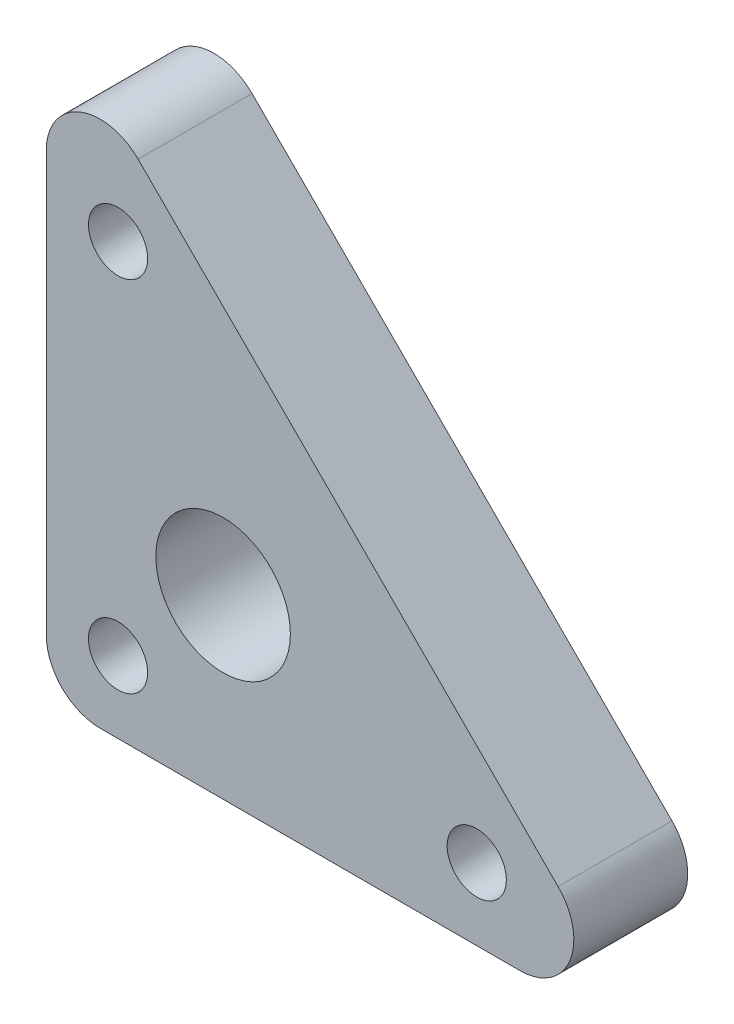
ISO-10303-21;
HEADER;
FILE_DESCRIPTION(('STEP AP214'),'2;1');
FILE_NAME('part.step','',(''),(''),'','','');
FILE_SCHEMA(('AUTOMOTIVE_DESIGN { 1 0 10303 214 1 1 1 1 }'));
ENDSEC;
DATA;
#1=APPLICATION_CONTEXT('core data for automotive mechanical design processes');
#2=APPLICATION_PROTOCOL_DEFINITION('international standard','automotive_design',2000,#1);
#3=PRODUCT_CONTEXT('',#1,'mechanical');
#4=PRODUCT('Part','Part','',(#3));
#5=PRODUCT_RELATED_PRODUCT_CATEGORY('part','',(#4));
#6=PRODUCT_DEFINITION_FORMATION('','',#4);
#7=PRODUCT_DEFINITION_CONTEXT('part definition',#1,'design');
#8=PRODUCT_DEFINITION('design','',#6,#7);
#9=PRODUCT_DEFINITION_SHAPE('','',#8);
#10=(LENGTH_UNIT() NAMED_UNIT(*) SI_UNIT(.MILLI.,.METRE.));
#11=(NAMED_UNIT(*) PLANE_ANGLE_UNIT() SI_UNIT($,.RADIAN.));
#12=(NAMED_UNIT(*) SI_UNIT($,.STERADIAN.) SOLID_ANGLE_UNIT());
#13=UNCERTAINTY_MEASURE_WITH_UNIT(LENGTH_MEASURE(1.E-05),#10,'distance_accuracy_value','');
#14=(GEOMETRIC_REPRESENTATION_CONTEXT(3) GLOBAL_UNCERTAINTY_ASSIGNED_CONTEXT((#13)) GLOBAL_UNIT_ASSIGNED_CONTEXT((#10,
#11,#12)) REPRESENTATION_CONTEXT('',''));
#15=CARTESIAN_POINT('',(0.,0.,0.));
#16=DIRECTION('',(0.,0.,1.));
#17=DIRECTION('',(1.,0.,0.));
#18=AXIS2_PLACEMENT_3D('',#15,#16,#17);
#19=CARTESIAN_POINT('',(0.,0.,6.35));
#20=DIRECTION('',(0.,0.,1.));
#21=DIRECTION('',(1.,0.,0.));
#22=AXIS2_PLACEMENT_3D('',#19,#20,#21);
#23=PLANE('',#22);
#24=CARTESIAN_POINT('',(0.,0.,6.35));
#25=DIRECTION('',(0.,0.,1.));
#26=DIRECTION('',(1.,0.,0.));
#27=AXIS2_PLACEMENT_3D('',#24,#25,#26);
#28=CIRCLE('',#27,1.65);
#29=CARTESIAN_POINT('',(1.65,0.,6.35));
#30=VERTEX_POINT('',#29);
#31=EDGE_CURVE('E267',#30,#30,#28,.T.);
#32=ORIENTED_EDGE('',*,*,#31,.F.);
#33=EDGE_LOOP('',(#32));
#34=FACE_BOUND('',#33,.T.);
#35=CARTESIAN_POINT('',(0.,20.,6.35));
#36=DIRECTION('',(0.,0.,1.));
#37=DIRECTION('',(1.,0.,0.));
#38=AXIS2_PLACEMENT_3D('',#35,#36,#37);
#39=CIRCLE('',#38,1.65);
#40=CARTESIAN_POINT('',(1.65,20.,6.35));
#41=VERTEX_POINT('',#40);
#42=EDGE_CURVE('E117',#41,#41,#39,.T.);
#43=ORIENTED_EDGE('',*,*,#42,.F.);
#44=EDGE_LOOP('',(#43));
#45=FACE_BOUND('',#44,.T.);
#46=DIRECTION('',(0.,-1.,0.));
#47=VECTOR('',#46,1.);
#48=CARTESIAN_POINT('',(-4.,-4.,6.35));
#49=LINE('',#48,#47);
#50=CARTESIAN_POINT('',(-4.,22.4142135623731,6.35));
#51=VERTEX_POINT('',#50);
#52=CARTESIAN_POINT('',(-4.,-1.,6.35));
#53=VERTEX_POINT('',#52);
#54=EDGE_CURVE('E115',#51,#53,#49,.T.);
#55=ORIENTED_EDGE('',*,*,#54,.T.);
#56=CARTESIAN_POINT('',(-1.,-1.,6.35));
#57=DIRECTION('',(0.,0.,1.));
#58=DIRECTION('',(1.,0.,0.));
#59=AXIS2_PLACEMENT_3D('',#56,#57,#58);
#60=CIRCLE('',#59,3.);
#61=CARTESIAN_POINT('',(-1.,-4.,6.35));
#62=VERTEX_POINT('',#61);
#63=EDGE_CURVE('E131',#53,#62,#60,.T.);
#64=ORIENTED_EDGE('',*,*,#63,.T.);
#65=DIRECTION('',(1.,0.,0.));
#66=VECTOR('',#65,1.);
#67=CARTESIAN_POINT('',(29.6568542494924,-4.,6.35));
#68=LINE('',#67,#66);
#69=CARTESIAN_POINT('',(22.4142135623731,-4.,6.35));
#70=VERTEX_POINT('',#69);
#71=EDGE_CURVE('E105',#62,#70,#68,.T.);
#72=ORIENTED_EDGE('',*,*,#71,.T.);
#73=CARTESIAN_POINT('',(22.4142135623731,-0.999999999999997,6.35));
#74=DIRECTION('',(0.,0.,1.));
#75=DIRECTION('',(1.,0.,0.));
#76=AXIS2_PLACEMENT_3D('',#73,#74,#75);
#77=CIRCLE('',#76,3.);
#78=CARTESIAN_POINT('',(24.5355339059327,1.12132034355964,6.35));
#79=VERTEX_POINT('',#78);
#80=EDGE_CURVE('E53',#70,#79,#77,.T.);
#81=ORIENTED_EDGE('',*,*,#80,.T.);
#82=DIRECTION('',(-0.707106781186547,0.707106781186548,0.));
#83=VECTOR('',#82,1.);
#84=CARTESIAN_POINT('',(-4.,29.6568542494924,6.35));
#85=LINE('',#84,#83);
#86=CARTESIAN_POINT('',(1.12132034355964,24.5355339059327,6.35));
#87=VERTEX_POINT('',#86);
#88=EDGE_CURVE('E121',#79,#87,#85,.T.);
#89=ORIENTED_EDGE('',*,*,#88,.T.);
#90=CARTESIAN_POINT('',(-1.,22.4142135623731,6.35));
#91=DIRECTION('',(0.,0.,1.));
#92=DIRECTION('',(1.,0.,0.));
#93=AXIS2_PLACEMENT_3D('',#90,#91,#92);
#94=CIRCLE('',#93,3.);
#95=EDGE_CURVE('E128',#87,#51,#94,.T.);
#96=ORIENTED_EDGE('',*,*,#95,.T.);
#97=EDGE_LOOP('',(#55,#64,#72,#81,#89,#96));
#98=FACE_BOUND('',#97,.T.);
#99=CARTESIAN_POINT('',(20.,0.,6.35));
#100=DIRECTION('',(0.,0.,1.));
#101=DIRECTION('',(1.,0.,0.));
#102=AXIS2_PLACEMENT_3D('',#99,#100,#101);
#103=CIRCLE('',#102,1.65);
#104=CARTESIAN_POINT('',(21.65,0.,6.35));
#105=VERTEX_POINT('',#104);
#106=EDGE_CURVE('E273',#105,#105,#103,.T.);
#107=ORIENTED_EDGE('',*,*,#106,.F.);
#108=EDGE_LOOP('',(#107));
#109=FACE_BOUND('',#108,.T.);
#110=CARTESIAN_POINT('',(5.85786437626904,5.85786437626904,6.35));
#111=DIRECTION('',(0.,0.,1.));
#112=DIRECTION('',(1.,0.,0.));
#113=AXIS2_PLACEMENT_3D('',#110,#111,#112);
#114=CIRCLE('',#113,3.75);
#115=CARTESIAN_POINT('',(9.60786437626904,5.85786437626904,6.35));
#116=VERTEX_POINT('',#115);
#117=EDGE_CURVE('E258',#116,#116,#114,.T.);
#118=ORIENTED_EDGE('',*,*,#117,.F.);
#119=EDGE_LOOP('',(#118));
#120=FACE_BOUND('',#119,.T.);
#121=ADVANCED_FACE('F32',(#34,#45,#98,#109,#120),#23,.T.);
#122=CARTESIAN_POINT('',(0.,0.,0.));
#123=DIRECTION('',(0.,0.,1.));
#124=DIRECTION('',(1.,0.,0.));
#125=AXIS2_PLACEMENT_3D('',#122,#123,#124);
#126=PLANE('',#125);
#127=CARTESIAN_POINT('',(0.,0.,0.));
#128=DIRECTION('',(0.,0.,1.));
#129=DIRECTION('',(1.,0.,0.));
#130=AXIS2_PLACEMENT_3D('',#127,#128,#129);
#131=CIRCLE('',#130,1.65);
#132=CARTESIAN_POINT('',(1.65,0.,0.));
#133=VERTEX_POINT('',#132);
#134=EDGE_CURVE('E264',#133,#133,#131,.T.);
#135=ORIENTED_EDGE('',*,*,#134,.T.);
#136=EDGE_LOOP('',(#135));
#137=FACE_BOUND('',#136,.T.);
#138=CARTESIAN_POINT('',(0.,20.,0.));
#139=DIRECTION('',(0.,0.,1.));
#140=DIRECTION('',(1.,0.,0.));
#141=AXIS2_PLACEMENT_3D('',#138,#139,#140);
#142=CIRCLE('',#141,1.65);
#143=CARTESIAN_POINT('',(1.65,20.,0.));
#144=VERTEX_POINT('',#143);
#145=EDGE_CURVE('E141',#144,#144,#142,.T.);
#146=ORIENTED_EDGE('',*,*,#145,.T.);
#147=EDGE_LOOP('',(#146));
#148=FACE_BOUND('',#147,.T.);
#149=DIRECTION('',(1.,0.,0.));
#150=VECTOR('',#149,1.);
#151=CARTESIAN_POINT('',(29.6568542494924,-4.,0.));
#152=LINE('',#151,#150);
#153=CARTESIAN_POINT('',(-1.,-4.,0.));
#154=VERTEX_POINT('',#153);
#155=CARTESIAN_POINT('',(22.4142135623731,-4.,0.));
#156=VERTEX_POINT('',#155);
#157=EDGE_CURVE('E103',#154,#156,#152,.T.);
#158=ORIENTED_EDGE('',*,*,#157,.F.);
#159=CARTESIAN_POINT('',(-1.,-1.,0.));
#160=DIRECTION('',(0.,0.,1.));
#161=DIRECTION('',(1.,0.,0.));
#162=AXIS2_PLACEMENT_3D('',#159,#160,#161);
#163=CIRCLE('',#162,3.);
#164=CARTESIAN_POINT('',(-4.,-1.,0.));
#165=VERTEX_POINT('',#164);
#166=EDGE_CURVE('E86',#154,#165,#163,.F.);
#167=ORIENTED_EDGE('',*,*,#166,.T.);
#168=DIRECTION('',(0.,-1.,0.));
#169=VECTOR('',#168,1.);
#170=CARTESIAN_POINT('',(-4.,-4.,0.));
#171=LINE('',#170,#169);
#172=CARTESIAN_POINT('',(-4.,22.4142135623731,0.));
#173=VERTEX_POINT('',#172);
#174=EDGE_CURVE('E113',#173,#165,#171,.T.);
#175=ORIENTED_EDGE('',*,*,#174,.F.);
#176=CARTESIAN_POINT('',(-1.,22.4142135623731,0.));
#177=DIRECTION('',(0.,0.,1.));
#178=DIRECTION('',(1.,0.,0.));
#179=AXIS2_PLACEMENT_3D('',#176,#177,#178);
#180=CIRCLE('',#179,3.);
#181=CARTESIAN_POINT('',(1.12132034355964,24.5355339059327,0.));
#182=VERTEX_POINT('',#181);
#183=EDGE_CURVE('E106',#173,#182,#180,.F.);
#184=ORIENTED_EDGE('',*,*,#183,.T.);
#185=DIRECTION('',(-0.707106781186547,0.707106781186548,0.));
#186=VECTOR('',#185,1.);
#187=CARTESIAN_POINT('',(-4.,29.6568542494924,0.));
#188=LINE('',#187,#186);
#189=CARTESIAN_POINT('',(24.5355339059327,1.12132034355964,0.));
#190=VERTEX_POINT('',#189);
#191=EDGE_CURVE('E112',#190,#182,#188,.T.);
#192=ORIENTED_EDGE('',*,*,#191,.F.);
#193=CARTESIAN_POINT('',(22.4142135623731,-0.999999999999997,0.));
#194=DIRECTION('',(0.,0.,1.));
#195=DIRECTION('',(1.,0.,0.));
#196=AXIS2_PLACEMENT_3D('',#193,#194,#195);
#197=CIRCLE('',#196,3.);
#198=EDGE_CURVE('E97',#190,#156,#197,.F.);
#199=ORIENTED_EDGE('',*,*,#198,.T.);
#200=EDGE_LOOP('',(#158,#167,#175,#184,#192,#199));
#201=FACE_BOUND('',#200,.T.);
#202=CARTESIAN_POINT('',(20.,0.,0.));
#203=DIRECTION('',(0.,0.,1.));
#204=DIRECTION('',(1.,0.,0.));
#205=AXIS2_PLACEMENT_3D('',#202,#203,#204);
#206=CIRCLE('',#205,1.65);
#207=CARTESIAN_POINT('',(21.65,0.,0.));
#208=VERTEX_POINT('',#207);
#209=EDGE_CURVE('E270',#208,#208,#206,.T.);
#210=ORIENTED_EDGE('',*,*,#209,.T.);
#211=EDGE_LOOP('',(#210));
#212=FACE_BOUND('',#211,.T.);
#213=CARTESIAN_POINT('',(5.85786437626904,5.85786437626904,0.));
#214=DIRECTION('',(0.,0.,1.));
#215=DIRECTION('',(1.,0.,0.));
#216=AXIS2_PLACEMENT_3D('',#213,#214,#215);
#217=CIRCLE('',#216,3.75);
#218=CARTESIAN_POINT('',(9.60786437626904,5.85786437626904,0.));
#219=VERTEX_POINT('',#218);
#220=EDGE_CURVE('E261',#219,#219,#217,.T.);
#221=ORIENTED_EDGE('',*,*,#220,.T.);
#222=EDGE_LOOP('',(#221));
#223=FACE_BOUND('',#222,.T.);
#224=ADVANCED_FACE('F109',(#137,#148,#201,#212,#223),#126,.F.);
#225=CARTESIAN_POINT('',(-4.,-4.,6.35));
#226=DIRECTION('',(1.,0.,0.));
#227=DIRECTION('',(0.,0.,-1.));
#228=AXIS2_PLACEMENT_3D('',#225,#226,#227);
#229=PLANE('',#228);
#230=ORIENTED_EDGE('',*,*,#174,.T.);
#231=DIRECTION('',(0.,0.,-1.));
#232=VECTOR('',#231,1.);
#233=CARTESIAN_POINT('',(-4.,-1.,6.35));
#234=LINE('',#233,#232);
#235=EDGE_CURVE('E91',#165,#53,#234,.F.);
#236=ORIENTED_EDGE('',*,*,#235,.T.);
#237=ORIENTED_EDGE('',*,*,#54,.F.);
#238=DIRECTION('',(0.,0.,-1.));
#239=VECTOR('',#238,1.);
#240=CARTESIAN_POINT('',(-4.,22.4142135623731,6.35));
#241=LINE('',#240,#239);
#242=EDGE_CURVE('E96',#51,#173,#241,.T.);
#243=ORIENTED_EDGE('',*,*,#242,.T.);
#244=EDGE_LOOP('',(#230,#236,#237,#243));
#245=FACE_BOUND('',#244,.T.);
#246=ADVANCED_FACE('F145',(#245),#229,.F.);
#247=CARTESIAN_POINT('',(29.6568542494924,-4.,6.35));
#248=DIRECTION('',(0.,1.,0.));
#249=DIRECTION('',(-1.,0.,0.));
#250=AXIS2_PLACEMENT_3D('',#247,#248,#249);
#251=PLANE('',#250);
#252=ORIENTED_EDGE('',*,*,#71,.F.);
#253=DIRECTION('',(0.,0.,-1.));
#254=VECTOR('',#253,1.);
#255=CARTESIAN_POINT('',(-1.,-4.,6.35));
#256=LINE('',#255,#254);
#257=EDGE_CURVE('E90',#62,#154,#256,.T.);
#258=ORIENTED_EDGE('',*,*,#257,.T.);
#259=ORIENTED_EDGE('',*,*,#157,.T.);
#260=DIRECTION('',(0.,0.,-1.));
#261=VECTOR('',#260,1.);
#262=CARTESIAN_POINT('',(22.4142135623731,-4.,6.35));
#263=LINE('',#262,#261);
#264=EDGE_CURVE('E107',#156,#70,#263,.F.);
#265=ORIENTED_EDGE('',*,*,#264,.T.);
#266=EDGE_LOOP('',(#252,#258,#259,#265));
#267=FACE_BOUND('',#266,.T.);
#268=ADVANCED_FACE('F102',(#267),#251,.F.);
#269=CARTESIAN_POINT('',(-4.,29.6568542494924,6.35));
#270=DIRECTION('',(-0.707106781186548,-0.707106781186547,0.));
#271=DIRECTION('',(0.707106781186547,-0.707106781186548,0.));
#272=AXIS2_PLACEMENT_3D('',#269,#270,#271);
#273=PLANE('',#272);
#274=ORIENTED_EDGE('',*,*,#88,.F.);
#275=DIRECTION('',(0.,0.,-1.));
#276=VECTOR('',#275,1.);
#277=CARTESIAN_POINT('',(24.5355339059327,1.12132034355964,6.35));
#278=LINE('',#277,#276);
#279=EDGE_CURVE('E11',#79,#190,#278,.T.);
#280=ORIENTED_EDGE('',*,*,#279,.T.);
#281=ORIENTED_EDGE('',*,*,#191,.T.);
#282=DIRECTION('',(0.,0.,-1.));
#283=VECTOR('',#282,1.);
#284=CARTESIAN_POINT('',(1.12132034355964,24.5355339059327,6.35));
#285=LINE('',#284,#283);
#286=EDGE_CURVE('E40',#182,#87,#285,.F.);
#287=ORIENTED_EDGE('',*,*,#286,.T.);
#288=EDGE_LOOP('',(#274,#280,#281,#287));
#289=FACE_BOUND('',#288,.T.);
#290=ADVANCED_FACE('F146',(#289),#273,.F.);
#291=CARTESIAN_POINT('',(0.,20.,6.35));
#292=DIRECTION('',(0.,0.,-1.));
#293=DIRECTION('',(-1.,0.,0.));
#294=AXIS2_PLACEMENT_3D('',#291,#292,#293);
#295=CYLINDRICAL_SURFACE('',#294,1.65);
#296=ORIENTED_EDGE('',*,*,#42,.T.);
#297=EDGE_LOOP('',(#296));
#298=FACE_BOUND('',#297,.T.);
#299=ORIENTED_EDGE('',*,*,#145,.F.);
#300=EDGE_LOOP('',(#299));
#301=FACE_BOUND('',#300,.T.);
#302=ADVANCED_FACE('F167',(#298,#301),#295,.F.);
#303=CARTESIAN_POINT('',(20.,0.,6.35));
#304=DIRECTION('',(0.,0.,-1.));
#305=DIRECTION('',(-1.,0.,0.));
#306=AXIS2_PLACEMENT_3D('',#303,#304,#305);
#307=CYLINDRICAL_SURFACE('',#306,1.65);
#308=ORIENTED_EDGE('',*,*,#106,.T.);
#309=EDGE_LOOP('',(#308));
#310=FACE_BOUND('',#309,.T.);
#311=ORIENTED_EDGE('',*,*,#209,.F.);
#312=EDGE_LOOP('',(#311));
#313=FACE_BOUND('',#312,.T.);
#314=ADVANCED_FACE('F194',(#310,#313),#307,.F.);
#315=CARTESIAN_POINT('',(0.,0.,6.35));
#316=DIRECTION('',(0.,0.,-1.));
#317=DIRECTION('',(-1.,0.,0.));
#318=AXIS2_PLACEMENT_3D('',#315,#316,#317);
#319=CYLINDRICAL_SURFACE('',#318,1.65);
#320=ORIENTED_EDGE('',*,*,#31,.T.);
#321=EDGE_LOOP('',(#320));
#322=FACE_BOUND('',#321,.T.);
#323=ORIENTED_EDGE('',*,*,#134,.F.);
#324=EDGE_LOOP('',(#323));
#325=FACE_BOUND('',#324,.T.);
#326=ADVANCED_FACE('F201',(#322,#325),#319,.F.);
#327=CARTESIAN_POINT('',(5.85786437626904,5.85786437626904,6.35));
#328=DIRECTION('',(0.,0.,-1.));
#329=DIRECTION('',(-1.,0.,0.));
#330=AXIS2_PLACEMENT_3D('',#327,#328,#329);
#331=CYLINDRICAL_SURFACE('',#330,3.75);
#332=ORIENTED_EDGE('',*,*,#117,.T.);
#333=EDGE_LOOP('',(#332));
#334=FACE_BOUND('',#333,.T.);
#335=ORIENTED_EDGE('',*,*,#220,.F.);
#336=EDGE_LOOP('',(#335));
#337=FACE_BOUND('',#336,.T.);
#338=ADVANCED_FACE('F154',(#334,#337),#331,.F.);
#339=CARTESIAN_POINT('',(-1.,-1.,6.35));
#340=DIRECTION('',(0.,0.,-1.));
#341=DIRECTION('',(-1.,0.,0.));
#342=AXIS2_PLACEMENT_3D('',#339,#340,#341);
#343=CYLINDRICAL_SURFACE('',#342,3.);
#344=ORIENTED_EDGE('',*,*,#63,.F.);
#345=ORIENTED_EDGE('',*,*,#235,.F.);
#346=ORIENTED_EDGE('',*,*,#166,.F.);
#347=ORIENTED_EDGE('',*,*,#257,.F.);
#348=EDGE_LOOP('',(#344,#345,#346,#347));
#349=FACE_BOUND('',#348,.T.);
#350=ADVANCED_FACE('F89',(#349),#343,.T.);
#351=CARTESIAN_POINT('',(22.4142135623731,-0.999999999999997,6.35));
#352=DIRECTION('',(0.,0.,-1.));
#353=DIRECTION('',(-1.,0.,0.));
#354=AXIS2_PLACEMENT_3D('',#351,#352,#353);
#355=CYLINDRICAL_SURFACE('',#354,3.);
#356=ORIENTED_EDGE('',*,*,#80,.F.);
#357=ORIENTED_EDGE('',*,*,#264,.F.);
#358=ORIENTED_EDGE('',*,*,#198,.F.);
#359=ORIENTED_EDGE('',*,*,#279,.F.);
#360=EDGE_LOOP('',(#356,#357,#358,#359));
#361=FACE_BOUND('',#360,.T.);
#362=ADVANCED_FACE('F148',(#361),#355,.T.);
#363=CARTESIAN_POINT('',(-1.,22.4142135623731,6.35));
#364=DIRECTION('',(0.,0.,-1.));
#365=DIRECTION('',(-1.,0.,0.));
#366=AXIS2_PLACEMENT_3D('',#363,#364,#365);
#367=CYLINDRICAL_SURFACE('',#366,3.);
#368=ORIENTED_EDGE('',*,*,#95,.F.);
#369=ORIENTED_EDGE('',*,*,#286,.F.);
#370=ORIENTED_EDGE('',*,*,#183,.F.);
#371=ORIENTED_EDGE('',*,*,#242,.F.);
#372=EDGE_LOOP('',(#368,#369,#370,#371));
#373=FACE_BOUND('',#372,.T.);
#374=ADVANCED_FACE('F34',(#373),#367,.T.);
#375=CLOSED_SHELL('',(#121,#224,#246,#268,#290,#302,#314,#326,#338,#350,#362,#374));
#376=MANIFOLD_SOLID_BREP('B2',#375);
#377=ADVANCED_BREP_SHAPE_REPRESENTATION('',(#18,#376),#14);
#378=SHAPE_DEFINITION_REPRESENTATION(#9,#377);
ENDSEC;
END-ISO-10303-21;
